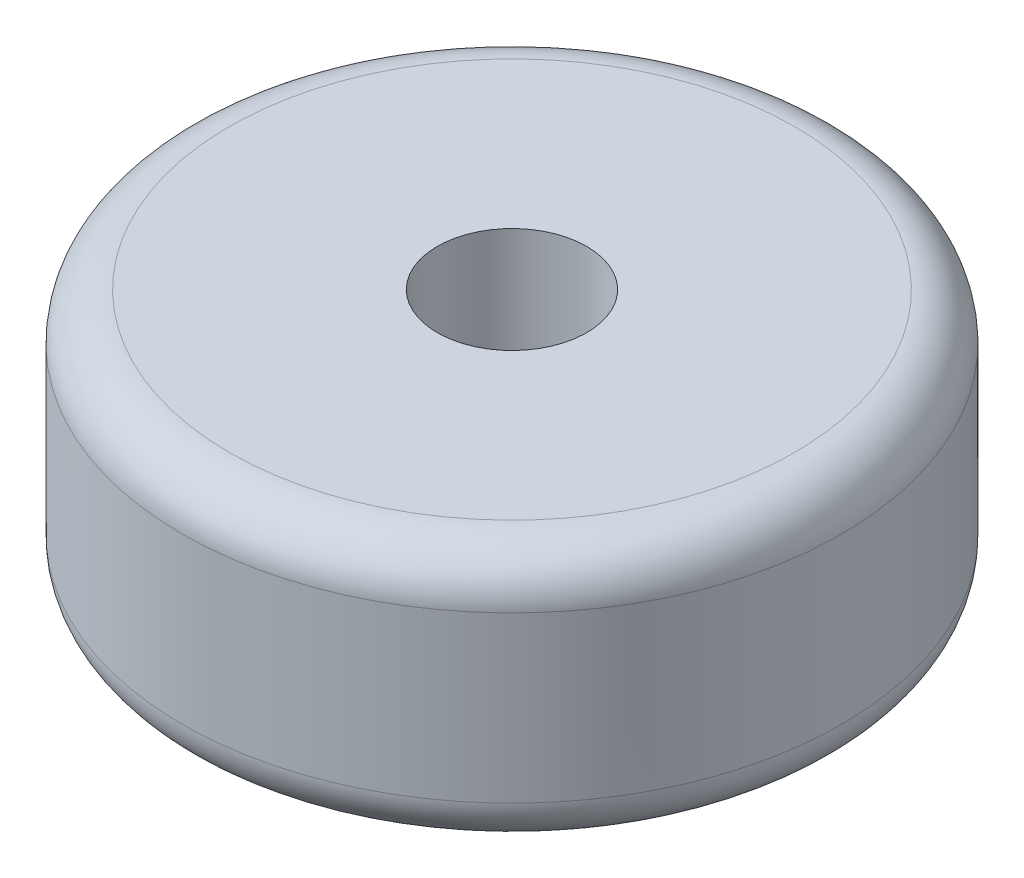
ISO-10303-21;
HEADER;
FILE_DESCRIPTION(('STEP AP214'),'2;1');
FILE_NAME('part.step','',(''),(''),'','','');
FILE_SCHEMA(('AUTOMOTIVE_DESIGN { 1 0 10303 214 1 1 1 1 }'));
ENDSEC;
DATA;
#1=APPLICATION_CONTEXT('core data for automotive mechanical design processes');
#2=APPLICATION_PROTOCOL_DEFINITION('international standard','automotive_design',2000,#1);
#3=PRODUCT_CONTEXT('',#1,'mechanical');
#4=PRODUCT('Part','Part','',(#3));
#5=PRODUCT_RELATED_PRODUCT_CATEGORY('part','',(#4));
#6=PRODUCT_DEFINITION_FORMATION('','',#4);
#7=PRODUCT_DEFINITION_CONTEXT('part definition',#1,'design');
#8=PRODUCT_DEFINITION('design','',#6,#7);
#9=PRODUCT_DEFINITION_SHAPE('','',#8);
#10=(LENGTH_UNIT() NAMED_UNIT(*) SI_UNIT(.MILLI.,.METRE.));
#11=(NAMED_UNIT(*) PLANE_ANGLE_UNIT() SI_UNIT($,.RADIAN.));
#12=(NAMED_UNIT(*) SI_UNIT($,.STERADIAN.) SOLID_ANGLE_UNIT());
#13=UNCERTAINTY_MEASURE_WITH_UNIT(LENGTH_MEASURE(1.E-05),#10,'distance_accuracy_value','');
#14=(GEOMETRIC_REPRESENTATION_CONTEXT(3) GLOBAL_UNCERTAINTY_ASSIGNED_CONTEXT((#13)) GLOBAL_UNIT_ASSIGNED_CONTEXT((#10,
#11,#12)) REPRESENTATION_CONTEXT('',''));
#15=CARTESIAN_POINT('',(0.,0.,0.));
#16=DIRECTION('',(0.,0.,1.));
#17=DIRECTION('',(1.,0.,0.));
#18=AXIS2_PLACEMENT_3D('',#15,#16,#17);
#19=CARTESIAN_POINT('',(0.,1.,0.));
#20=DIRECTION('',(0.,1.,0.));
#21=DIRECTION('',(0.,0.,1.));
#22=AXIS2_PLACEMENT_3D('',#19,#20,#21);
#23=TOROIDAL_SURFACE('',#22,6.,1.);
#24=CARTESIAN_POINT('',(0.,0.,0.));
#25=DIRECTION('',(0.,1.,0.));
#26=DIRECTION('',(0.,0.,1.));
#27=AXIS2_PLACEMENT_3D('',#24,#25,#26);
#28=CIRCLE('',#27,6.);
#29=CARTESIAN_POINT('',(0.,0.,6.));
#30=VERTEX_POINT('',#29);
#31=CARTESIAN_POINT('',(0.,0.,-6.));
#32=VERTEX_POINT('',#31);
#33=EDGE_CURVE('E48',#30,#32,#28,.T.);
#34=ORIENTED_EDGE('',*,*,#33,.T.);
#35=CARTESIAN_POINT('',(0.,0.,0.));
#36=DIRECTION('',(0.,1.,0.));
#37=DIRECTION('',(0.,0.,-1.));
#38=AXIS2_PLACEMENT_3D('',#35,#36,#37);
#39=CIRCLE('',#38,6.);
#40=EDGE_CURVE('E45',#32,#30,#39,.T.);
#41=ORIENTED_EDGE('',*,*,#40,.T.);
#42=EDGE_LOOP('',(#34,#41));
#43=FACE_BOUND('',#42,.T.);
#44=CARTESIAN_POINT('',(0.,1.,0.));
#45=DIRECTION('',(0.,-1.,0.));
#46=DIRECTION('',(0.,0.,-1.));
#47=AXIS2_PLACEMENT_3D('',#44,#45,#46);
#48=CIRCLE('',#47,7.);
#49=CARTESIAN_POINT('',(0.,1.,-7.));
#50=VERTEX_POINT('',#49);
#51=EDGE_CURVE('E52',#50,#50,#48,.F.);
#52=ORIENTED_EDGE('',*,*,#51,.F.);
#53=EDGE_LOOP('',(#52));
#54=FACE_BOUND('',#53,.T.);
#55=ADVANCED_FACE('F17',(#43,#54),#23,.T.);
#56=CARTESIAN_POINT('',(0.,5.5,0.));
#57=DIRECTION('',(0.,-1.,0.));
#58=DIRECTION('',(0.,0.,-1.));
#59=AXIS2_PLACEMENT_3D('',#56,#57,#58);
#60=CYLINDRICAL_SURFACE('',#59,7.);
#61=CARTESIAN_POINT('',(0.,4.5,0.));
#62=DIRECTION('',(0.,1.,0.));
#63=DIRECTION('',(0.,0.,1.));
#64=AXIS2_PLACEMENT_3D('',#61,#62,#63);
#65=CIRCLE('',#64,7.);
#66=CARTESIAN_POINT('',(0.,4.5,7.));
#67=VERTEX_POINT('',#66);
#68=EDGE_CURVE('E56',#67,#67,#65,.T.);
#69=ORIENTED_EDGE('',*,*,#68,.F.);
#70=EDGE_LOOP('',(#69));
#71=FACE_BOUND('',#70,.T.);
#72=ORIENTED_EDGE('',*,*,#51,.T.);
#73=EDGE_LOOP('',(#72));
#74=FACE_BOUND('',#73,.T.);
#75=ADVANCED_FACE('F74',(#71,#74),#60,.T.);
#76=CARTESIAN_POINT('',(0.,0.,0.));
#77=DIRECTION('',(0.,1.,0.));
#78=DIRECTION('',(0.,0.,1.));
#79=AXIS2_PLACEMENT_3D('',#76,#77,#78);
#80=PLANE('',#79);
#81=CARTESIAN_POINT('',(0.,0.,0.));
#82=DIRECTION('',(0.,-1.,0.));
#83=DIRECTION('',(0.,0.,-1.));
#84=AXIS2_PLACEMENT_3D('',#81,#82,#83);
#85=CIRCLE('',#84,1.5875);
#86=CARTESIAN_POINT('',(0.,0.,-1.5875));
#87=VERTEX_POINT('',#86);
#88=EDGE_CURVE('E123',#87,#87,#85,.F.);
#89=ORIENTED_EDGE('',*,*,#88,.T.);
#90=EDGE_LOOP('',(#89));
#91=FACE_BOUND('',#90,.T.);
#92=ORIENTED_EDGE('',*,*,#33,.F.);
#93=ORIENTED_EDGE('',*,*,#40,.F.);
#94=EDGE_LOOP('',(#92,#93));
#95=FACE_BOUND('',#94,.T.);
#96=ADVANCED_FACE('F55',(#91,#95),#80,.F.);
#97=CARTESIAN_POINT('',(0.,4.5,0.));
#98=DIRECTION('',(0.,1.,0.));
#99=DIRECTION('',(0.,0.,1.));
#100=AXIS2_PLACEMENT_3D('',#97,#98,#99);
#101=TOROIDAL_SURFACE('',#100,6.,1.);
#102=ORIENTED_EDGE('',*,*,#68,.T.);
#103=EDGE_LOOP('',(#102));
#104=FACE_BOUND('',#103,.T.);
#105=CARTESIAN_POINT('',(0.,5.5,0.));
#106=DIRECTION('',(0.,-1.,0.));
#107=DIRECTION('',(0.,0.,1.));
#108=AXIS2_PLACEMENT_3D('',#105,#106,#107);
#109=CIRCLE('',#108,6.);
#110=CARTESIAN_POINT('',(0.,5.5,-6.));
#111=VERTEX_POINT('',#110);
#112=CARTESIAN_POINT('',(0.,5.5,6.));
#113=VERTEX_POINT('',#112);
#114=EDGE_CURVE('E29',#111,#113,#109,.F.);
#115=ORIENTED_EDGE('',*,*,#114,.F.);
#116=CARTESIAN_POINT('',(0.,5.5,0.));
#117=DIRECTION('',(0.,-1.,0.));
#118=DIRECTION('',(0.,0.,-1.));
#119=AXIS2_PLACEMENT_3D('',#116,#117,#118);
#120=CIRCLE('',#119,6.);
#121=EDGE_CURVE('E122',#113,#111,#120,.F.);
#122=ORIENTED_EDGE('',*,*,#121,.F.);
#123=EDGE_LOOP('',(#115,#122));
#124=FACE_BOUND('',#123,.T.);
#125=ADVANCED_FACE('F73',(#104,#124),#101,.T.);
#126=CARTESIAN_POINT('',(0.,5.5,0.));
#127=DIRECTION('',(0.,-1.,0.));
#128=DIRECTION('',(0.,0.,-1.));
#129=AXIS2_PLACEMENT_3D('',#126,#127,#128);
#130=CYLINDRICAL_SURFACE('',#129,1.5875);
#131=CARTESIAN_POINT('',(0.,5.5,0.));
#132=DIRECTION('',(0.,-1.,0.));
#133=DIRECTION('',(0.,0.,-1.));
#134=AXIS2_PLACEMENT_3D('',#131,#132,#133);
#135=CIRCLE('',#134,1.5875);
#136=CARTESIAN_POINT('',(0.,5.5,-1.5875));
#137=VERTEX_POINT('',#136);
#138=EDGE_CURVE('E11',#137,#137,#135,.T.);
#139=ORIENTED_EDGE('',*,*,#138,.F.);
#140=EDGE_LOOP('',(#139));
#141=FACE_BOUND('',#140,.T.);
#142=ORIENTED_EDGE('',*,*,#88,.F.);
#143=EDGE_LOOP('',(#142));
#144=FACE_BOUND('',#143,.T.);
#145=ADVANCED_FACE('F90',(#141,#144),#130,.F.);
#146=CARTESIAN_POINT('',(0.,5.5,0.));
#147=DIRECTION('',(0.,1.,0.));
#148=DIRECTION('',(0.,0.,1.));
#149=AXIS2_PLACEMENT_3D('',#146,#147,#148);
#150=PLANE('',#149);
#151=ORIENTED_EDGE('',*,*,#138,.T.);
#152=EDGE_LOOP('',(#151));
#153=FACE_BOUND('',#152,.T.);
#154=ORIENTED_EDGE('',*,*,#121,.T.);
#155=ORIENTED_EDGE('',*,*,#114,.T.);
#156=EDGE_LOOP('',(#154,#155));
#157=FACE_BOUND('',#156,.T.);
#158=ADVANCED_FACE('F88',(#153,#157),#150,.T.);
#159=CLOSED_SHELL('',(#55,#75,#96,#125,#145,#158));
#160=MANIFOLD_SOLID_BREP('B1',#159);
#161=ADVANCED_BREP_SHAPE_REPRESENTATION('',(#18,#160),#14);
#162=SHAPE_DEFINITION_REPRESENTATION(#9,#161);
ENDSEC;
END-ISO-10303-21;
